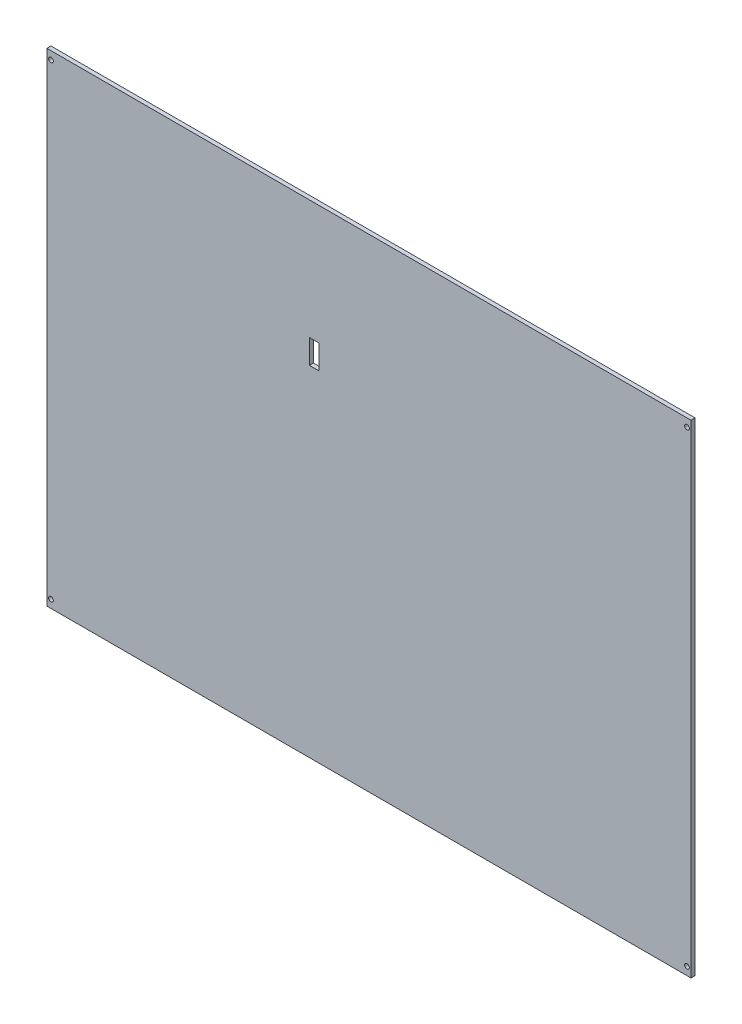
ISO-10303-21;
HEADER;
FILE_DESCRIPTION(('STEP AP214'),'2;1');
FILE_NAME('part.step','',(''),(''),'','','');
FILE_SCHEMA(('AUTOMOTIVE_DESIGN { 1 0 10303 214 1 1 1 1 }'));
ENDSEC;
DATA;
#1=APPLICATION_CONTEXT('core data for automotive mechanical design processes');
#2=APPLICATION_PROTOCOL_DEFINITION('international standard','automotive_design',2000,#1);
#3=PRODUCT_CONTEXT('',#1,'mechanical');
#4=PRODUCT('Part','Part','',(#3));
#5=PRODUCT_RELATED_PRODUCT_CATEGORY('part','',(#4));
#6=PRODUCT_DEFINITION_FORMATION('','',#4);
#7=PRODUCT_DEFINITION_CONTEXT('part definition',#1,'design');
#8=PRODUCT_DEFINITION('design','',#6,#7);
#9=PRODUCT_DEFINITION_SHAPE('','',#8);
#10=(LENGTH_UNIT() NAMED_UNIT(*) SI_UNIT(.MILLI.,.METRE.));
#11=(NAMED_UNIT(*) PLANE_ANGLE_UNIT() SI_UNIT($,.RADIAN.));
#12=(NAMED_UNIT(*) SI_UNIT($,.STERADIAN.) SOLID_ANGLE_UNIT());
#13=UNCERTAINTY_MEASURE_WITH_UNIT(LENGTH_MEASURE(1.E-05),#10,'distance_accuracy_value','');
#14=(GEOMETRIC_REPRESENTATION_CONTEXT(3) GLOBAL_UNCERTAINTY_ASSIGNED_CONTEXT((#13)) GLOBAL_UNIT_ASSIGNED_CONTEXT((#10,
#11,#12)) REPRESENTATION_CONTEXT('',''));
#15=CARTESIAN_POINT('',(0.,0.,0.));
#16=DIRECTION('',(0.,0.,1.));
#17=DIRECTION('',(1.,0.,0.));
#18=AXIS2_PLACEMENT_3D('',#15,#16,#17);
#19=CARTESIAN_POINT('',(254.,-190.5,3.175));
#20=DIRECTION('',(-1.,0.,0.));
#21=DIRECTION('',(0.,0.,1.));
#22=AXIS2_PLACEMENT_3D('',#19,#20,#21);
#23=PLANE('',#22);
#24=DIRECTION('',(0.,1.,0.));
#25=VECTOR('',#24,1.);
#26=CARTESIAN_POINT('',(254.,-190.5,0.));
#27=LINE('',#26,#25);
#28=CARTESIAN_POINT('',(254.,-190.5,0.));
#29=VERTEX_POINT('',#28);
#30=CARTESIAN_POINT('',(254.,190.5,0.));
#31=VERTEX_POINT('',#30);
#32=EDGE_CURVE('E182',#29,#31,#27,.T.);
#33=ORIENTED_EDGE('',*,*,#32,.T.);
#34=DIRECTION('',(0.,0.,-1.));
#35=VECTOR('',#34,1.);
#36=CARTESIAN_POINT('',(254.,190.5,3.175));
#37=LINE('',#36,#35);
#38=CARTESIAN_POINT('',(254.,190.5,3.175));
#39=VERTEX_POINT('',#38);
#40=EDGE_CURVE('E11',#39,#31,#37,.T.);
#41=ORIENTED_EDGE('',*,*,#40,.F.);
#42=DIRECTION('',(0.,1.,0.));
#43=VECTOR('',#42,1.);
#44=CARTESIAN_POINT('',(254.,-190.5,3.175));
#45=LINE('',#44,#43);
#46=CARTESIAN_POINT('',(254.,-190.5,3.175));
#47=VERTEX_POINT('',#46);
#48=EDGE_CURVE('E186',#47,#39,#45,.T.);
#49=ORIENTED_EDGE('',*,*,#48,.F.);
#50=DIRECTION('',(0.,0.,-1.));
#51=VECTOR('',#50,1.);
#52=CARTESIAN_POINT('',(254.,-190.5,3.175));
#53=LINE('',#52,#51);
#54=EDGE_CURVE('E200',#47,#29,#53,.T.);
#55=ORIENTED_EDGE('',*,*,#54,.T.);
#56=EDGE_LOOP('',(#33,#41,#49,#55));
#57=FACE_BOUND('',#56,.T.);
#58=ADVANCED_FACE('F42',(#57),#23,.F.);
#59=CARTESIAN_POINT('',(-254.,190.5,3.175));
#60=DIRECTION('',(0.,-1.,0.));
#61=DIRECTION('',(0.,0.,-1.));
#62=AXIS2_PLACEMENT_3D('',#59,#60,#61);
#63=PLANE('',#62);
#64=DIRECTION('',(-1.,0.,0.));
#65=VECTOR('',#64,1.);
#66=CARTESIAN_POINT('',(-254.,190.5,0.));
#67=LINE('',#66,#65);
#68=CARTESIAN_POINT('',(-254.,190.5,0.));
#69=VERTEX_POINT('',#68);
#70=EDGE_CURVE('E204',#31,#69,#67,.T.);
#71=ORIENTED_EDGE('',*,*,#70,.T.);
#72=DIRECTION('',(0.,0.,-1.));
#73=VECTOR('',#72,1.);
#74=CARTESIAN_POINT('',(-254.,190.5,3.175));
#75=LINE('',#74,#73);
#76=CARTESIAN_POINT('',(-254.,190.5,3.175));
#77=VERTEX_POINT('',#76);
#78=EDGE_CURVE('E50',#77,#69,#75,.T.);
#79=ORIENTED_EDGE('',*,*,#78,.F.);
#80=DIRECTION('',(-1.,0.,0.));
#81=VECTOR('',#80,1.);
#82=CARTESIAN_POINT('',(-254.,190.5,3.175));
#83=LINE('',#82,#81);
#84=EDGE_CURVE('E190',#39,#77,#83,.T.);
#85=ORIENTED_EDGE('',*,*,#84,.F.);
#86=ORIENTED_EDGE('',*,*,#40,.T.);
#87=EDGE_LOOP('',(#71,#79,#85,#86));
#88=FACE_BOUND('',#87,.T.);
#89=ADVANCED_FACE('F239',(#88),#63,.F.);
#90=CARTESIAN_POINT('',(-254.,-190.5,3.175));
#91=DIRECTION('',(1.,0.,0.));
#92=DIRECTION('',(0.,0.,-1.));
#93=AXIS2_PLACEMENT_3D('',#90,#91,#92);
#94=PLANE('',#93);
#95=DIRECTION('',(0.,-1.,0.));
#96=VECTOR('',#95,1.);
#97=CARTESIAN_POINT('',(-254.,-190.5,0.));
#98=LINE('',#97,#96);
#99=CARTESIAN_POINT('',(-254.,-190.5,0.));
#100=VERTEX_POINT('',#99);
#101=EDGE_CURVE('E207',#69,#100,#98,.T.);
#102=ORIENTED_EDGE('',*,*,#101,.T.);
#103=DIRECTION('',(0.,0.,-1.));
#104=VECTOR('',#103,1.);
#105=CARTESIAN_POINT('',(-254.,-190.5,3.175));
#106=LINE('',#105,#104);
#107=CARTESIAN_POINT('',(-254.,-190.5,3.175));
#108=VERTEX_POINT('',#107);
#109=EDGE_CURVE('E215',#108,#100,#106,.T.);
#110=ORIENTED_EDGE('',*,*,#109,.F.);
#111=DIRECTION('',(0.,-1.,0.));
#112=VECTOR('',#111,1.);
#113=CARTESIAN_POINT('',(-254.,-190.5,3.175));
#114=LINE('',#113,#112);
#115=EDGE_CURVE('E194',#77,#108,#114,.T.);
#116=ORIENTED_EDGE('',*,*,#115,.F.);
#117=ORIENTED_EDGE('',*,*,#78,.T.);
#118=EDGE_LOOP('',(#102,#110,#116,#117));
#119=FACE_BOUND('',#118,.T.);
#120=ADVANCED_FACE('F224',(#119),#94,.F.);
#121=CARTESIAN_POINT('',(-254.,-190.5,3.175));
#122=DIRECTION('',(0.,1.,0.));
#123=DIRECTION('',(0.,0.,1.));
#124=AXIS2_PLACEMENT_3D('',#121,#122,#123);
#125=PLANE('',#124);
#126=DIRECTION('',(1.,0.,0.));
#127=VECTOR('',#126,1.);
#128=CARTESIAN_POINT('',(-254.,-190.5,0.));
#129=LINE('',#128,#127);
#130=EDGE_CURVE('E191',#100,#29,#129,.T.);
#131=ORIENTED_EDGE('',*,*,#130,.T.);
#132=ORIENTED_EDGE('',*,*,#54,.F.);
#133=DIRECTION('',(1.,0.,0.));
#134=VECTOR('',#133,1.);
#135=CARTESIAN_POINT('',(-254.,-190.5,3.175));
#136=LINE('',#135,#134);
#137=EDGE_CURVE('E197',#108,#47,#136,.T.);
#138=ORIENTED_EDGE('',*,*,#137,.F.);
#139=ORIENTED_EDGE('',*,*,#109,.T.);
#140=EDGE_LOOP('',(#131,#132,#138,#139));
#141=FACE_BOUND('',#140,.T.);
#142=ADVANCED_FACE('F232',(#141),#125,.F.);
#143=CARTESIAN_POINT('',(0.,0.,3.175));
#144=DIRECTION('',(0.,0.,-1.));
#145=DIRECTION('',(-1.,0.,0.));
#146=AXIS2_PLACEMENT_3D('',#143,#144,#145);
#147=PLANE('',#146);
#148=DIRECTION('',(0.,1.,0.));
#149=VECTOR('',#148,1.);
#150=CARTESIAN_POINT('',(-39.3700000000001,77.47,3.175));
#151=LINE('',#150,#149);
#152=CARTESIAN_POINT('',(-39.3700000000001,77.47,3.175));
#153=VERTEX_POINT('',#152);
#154=CARTESIAN_POINT('',(-39.3700000000001,96.52,3.175));
#155=VERTEX_POINT('',#154);
#156=EDGE_CURVE('E135',#153,#155,#151,.T.);
#157=ORIENTED_EDGE('',*,*,#156,.F.);
#158=DIRECTION('',(1.,0.,0.));
#159=VECTOR('',#158,1.);
#160=CARTESIAN_POINT('',(-46.9900000000001,77.47,3.175));
#161=LINE('',#160,#159);
#162=CARTESIAN_POINT('',(-46.9900000000001,77.47,3.175));
#163=VERTEX_POINT('',#162);
#164=EDGE_CURVE('E125',#163,#153,#161,.T.);
#165=ORIENTED_EDGE('',*,*,#164,.F.);
#166=DIRECTION('',(0.,-1.,0.));
#167=VECTOR('',#166,1.);
#168=CARTESIAN_POINT('',(-46.9900000000001,77.47,3.175));
#169=LINE('',#168,#167);
#170=CARTESIAN_POINT('',(-46.9900000000001,96.52,3.175));
#171=VERTEX_POINT('',#170);
#172=EDGE_CURVE('E139',#171,#163,#169,.T.);
#173=ORIENTED_EDGE('',*,*,#172,.F.);
#174=DIRECTION('',(-1.,0.,0.));
#175=VECTOR('',#174,1.);
#176=CARTESIAN_POINT('',(-46.9900000000001,96.52,3.175));
#177=LINE('',#176,#175);
#178=EDGE_CURVE('E57',#155,#171,#177,.T.);
#179=ORIENTED_EDGE('',*,*,#178,.F.);
#180=EDGE_LOOP('',(#157,#165,#173,#179));
#181=FACE_BOUND('',#180,.T.);
#182=CARTESIAN_POINT('',(250.825,-184.15,3.175));
#183=DIRECTION('',(0.,0.,1.));
#184=DIRECTION('',(1.,0.,0.));
#185=AXIS2_PLACEMENT_3D('',#182,#183,#184);
#186=CIRCLE('',#185,1.85419999999999);
#187=CARTESIAN_POINT('',(252.6792,-184.15,3.175));
#188=VERTEX_POINT('',#187);
#189=EDGE_CURVE('E171',#188,#188,#186,.T.);
#190=ORIENTED_EDGE('',*,*,#189,.F.);
#191=EDGE_LOOP('',(#190));
#192=FACE_BOUND('',#191,.T.);
#193=CARTESIAN_POINT('',(250.825,184.15,3.175));
#194=DIRECTION('',(0.,0.,1.));
#195=DIRECTION('',(1.,0.,0.));
#196=AXIS2_PLACEMENT_3D('',#193,#194,#195);
#197=CIRCLE('',#196,1.85419999999999);
#198=CARTESIAN_POINT('',(252.6792,184.15,3.175));
#199=VERTEX_POINT('',#198);
#200=EDGE_CURVE('E163',#199,#199,#197,.T.);
#201=ORIENTED_EDGE('',*,*,#200,.F.);
#202=EDGE_LOOP('',(#201));
#203=FACE_BOUND('',#202,.T.);
#204=CARTESIAN_POINT('',(-250.825,184.15,3.175));
#205=DIRECTION('',(0.,0.,1.));
#206=DIRECTION('',(1.,0.,0.));
#207=AXIS2_PLACEMENT_3D('',#204,#205,#206);
#208=CIRCLE('',#207,1.85419999999999);
#209=CARTESIAN_POINT('',(-248.9708,184.15,3.175));
#210=VERTEX_POINT('',#209);
#211=EDGE_CURVE('E154',#210,#210,#208,.T.);
#212=ORIENTED_EDGE('',*,*,#211,.F.);
#213=EDGE_LOOP('',(#212));
#214=FACE_BOUND('',#213,.T.);
#215=CARTESIAN_POINT('',(-250.825,-184.15,3.175));
#216=DIRECTION('',(0.,0.,1.));
#217=DIRECTION('',(1.,0.,0.));
#218=AXIS2_PLACEMENT_3D('',#215,#216,#217);
#219=CIRCLE('',#218,1.85419999999999);
#220=CARTESIAN_POINT('',(-248.9708,-184.15,3.175));
#221=VERTEX_POINT('',#220);
#222=EDGE_CURVE('E158',#221,#221,#219,.T.);
#223=ORIENTED_EDGE('',*,*,#222,.F.);
#224=EDGE_LOOP('',(#223));
#225=FACE_BOUND('',#224,.T.);
#226=ORIENTED_EDGE('',*,*,#48,.T.);
#227=ORIENTED_EDGE('',*,*,#84,.T.);
#228=ORIENTED_EDGE('',*,*,#115,.T.);
#229=ORIENTED_EDGE('',*,*,#137,.T.);
#230=EDGE_LOOP('',(#226,#227,#228,#229));
#231=FACE_BOUND('',#230,.T.);
#232=ADVANCED_FACE('F238',(#181,#192,#203,#214,#225,#231),#147,.F.);
#233=CARTESIAN_POINT('',(0.,0.,0.));
#234=DIRECTION('',(0.,0.,-1.));
#235=DIRECTION('',(-1.,0.,0.));
#236=AXIS2_PLACEMENT_3D('',#233,#234,#235);
#237=PLANE('',#236);
#238=DIRECTION('',(1.,0.,0.));
#239=VECTOR('',#238,1.);
#240=CARTESIAN_POINT('',(-46.9900000000001,77.47,0.));
#241=LINE('',#240,#239);
#242=CARTESIAN_POINT('',(-46.9900000000001,77.47,0.));
#243=VERTEX_POINT('',#242);
#244=CARTESIAN_POINT('',(-39.3700000000001,77.47,0.));
#245=VERTEX_POINT('',#244);
#246=EDGE_CURVE('E122',#243,#245,#241,.T.);
#247=ORIENTED_EDGE('',*,*,#246,.T.);
#248=DIRECTION('',(0.,1.,0.));
#249=VECTOR('',#248,1.);
#250=CARTESIAN_POINT('',(-39.3700000000001,77.47,0.));
#251=LINE('',#250,#249);
#252=CARTESIAN_POINT('',(-39.3700000000001,96.52,0.));
#253=VERTEX_POINT('',#252);
#254=EDGE_CURVE('E108',#245,#253,#251,.T.);
#255=ORIENTED_EDGE('',*,*,#254,.T.);
#256=DIRECTION('',(-1.,0.,0.));
#257=VECTOR('',#256,1.);
#258=CARTESIAN_POINT('',(-46.9900000000001,96.52,0.));
#259=LINE('',#258,#257);
#260=CARTESIAN_POINT('',(-46.9900000000001,96.52,0.));
#261=VERTEX_POINT('',#260);
#262=EDGE_CURVE('E144',#253,#261,#259,.T.);
#263=ORIENTED_EDGE('',*,*,#262,.T.);
#264=DIRECTION('',(0.,-1.,0.));
#265=VECTOR('',#264,1.);
#266=CARTESIAN_POINT('',(-46.9900000000001,77.47,0.));
#267=LINE('',#266,#265);
#268=EDGE_CURVE('E131',#261,#243,#267,.T.);
#269=ORIENTED_EDGE('',*,*,#268,.T.);
#270=EDGE_LOOP('',(#247,#255,#263,#269));
#271=FACE_BOUND('',#270,.T.);
#272=CARTESIAN_POINT('',(250.825,-184.15,0.));
#273=DIRECTION('',(0.,0.,1.));
#274=DIRECTION('',(1.,0.,0.));
#275=AXIS2_PLACEMENT_3D('',#272,#273,#274);
#276=CIRCLE('',#275,1.85419999999999);
#277=CARTESIAN_POINT('',(252.6792,-184.15,0.));
#278=VERTEX_POINT('',#277);
#279=EDGE_CURVE('E153',#278,#278,#276,.T.);
#280=ORIENTED_EDGE('',*,*,#279,.T.);
#281=EDGE_LOOP('',(#280));
#282=FACE_BOUND('',#281,.T.);
#283=CARTESIAN_POINT('',(250.825,184.15,0.));
#284=DIRECTION('',(0.,0.,1.));
#285=DIRECTION('',(1.,0.,0.));
#286=AXIS2_PLACEMENT_3D('',#283,#284,#285);
#287=CIRCLE('',#286,1.85419999999999);
#288=CARTESIAN_POINT('',(252.6792,184.15,0.));
#289=VERTEX_POINT('',#288);
#290=EDGE_CURVE('E167',#289,#289,#287,.T.);
#291=ORIENTED_EDGE('',*,*,#290,.T.);
#292=EDGE_LOOP('',(#291));
#293=FACE_BOUND('',#292,.T.);
#294=CARTESIAN_POINT('',(-250.825,184.15,0.));
#295=DIRECTION('',(0.,0.,1.));
#296=DIRECTION('',(1.,0.,0.));
#297=AXIS2_PLACEMENT_3D('',#294,#295,#296);
#298=CIRCLE('',#297,1.85419999999999);
#299=CARTESIAN_POINT('',(-248.9708,184.15,0.));
#300=VERTEX_POINT('',#299);
#301=EDGE_CURVE('E159',#300,#300,#298,.T.);
#302=ORIENTED_EDGE('',*,*,#301,.T.);
#303=EDGE_LOOP('',(#302));
#304=FACE_BOUND('',#303,.T.);
#305=CARTESIAN_POINT('',(-250.825,-184.15,0.));
#306=DIRECTION('',(0.,0.,1.));
#307=DIRECTION('',(1.,0.,0.));
#308=AXIS2_PLACEMENT_3D('',#305,#306,#307);
#309=CIRCLE('',#308,1.85419999999999);
#310=CARTESIAN_POINT('',(-248.9708,-184.15,0.));
#311=VERTEX_POINT('',#310);
#312=EDGE_CURVE('E178',#311,#311,#309,.T.);
#313=ORIENTED_EDGE('',*,*,#312,.T.);
#314=EDGE_LOOP('',(#313));
#315=FACE_BOUND('',#314,.T.);
#316=ORIENTED_EDGE('',*,*,#32,.F.);
#317=ORIENTED_EDGE('',*,*,#130,.F.);
#318=ORIENTED_EDGE('',*,*,#101,.F.);
#319=ORIENTED_EDGE('',*,*,#70,.F.);
#320=EDGE_LOOP('',(#316,#317,#318,#319));
#321=FACE_BOUND('',#320,.T.);
#322=ADVANCED_FACE('F129',(#271,#282,#293,#304,#315,#321),#237,.T.);
#323=CARTESIAN_POINT('',(-250.825,-184.15,0.));
#324=DIRECTION('',(0.,0.,1.));
#325=DIRECTION('',(1.,0.,0.));
#326=AXIS2_PLACEMENT_3D('',#323,#324,#325);
#327=CYLINDRICAL_SURFACE('',#326,1.85419999999999);
#328=ORIENTED_EDGE('',*,*,#312,.F.);
#329=EDGE_LOOP('',(#328));
#330=FACE_BOUND('',#329,.T.);
#331=ORIENTED_EDGE('',*,*,#222,.T.);
#332=EDGE_LOOP('',(#331));
#333=FACE_BOUND('',#332,.T.);
#334=ADVANCED_FACE('F251',(#330,#333),#327,.F.);
#335=CARTESIAN_POINT('',(-250.825,184.15,0.));
#336=DIRECTION('',(0.,0.,1.));
#337=DIRECTION('',(1.,0.,0.));
#338=AXIS2_PLACEMENT_3D('',#335,#336,#337);
#339=CYLINDRICAL_SURFACE('',#338,1.85419999999999);
#340=ORIENTED_EDGE('',*,*,#301,.F.);
#341=EDGE_LOOP('',(#340));
#342=FACE_BOUND('',#341,.T.);
#343=ORIENTED_EDGE('',*,*,#211,.T.);
#344=EDGE_LOOP('',(#343));
#345=FACE_BOUND('',#344,.T.);
#346=ADVANCED_FACE('F257',(#342,#345),#339,.F.);
#347=CARTESIAN_POINT('',(250.825,184.15,0.));
#348=DIRECTION('',(0.,0.,1.));
#349=DIRECTION('',(1.,0.,0.));
#350=AXIS2_PLACEMENT_3D('',#347,#348,#349);
#351=CYLINDRICAL_SURFACE('',#350,1.85419999999999);
#352=ORIENTED_EDGE('',*,*,#290,.F.);
#353=EDGE_LOOP('',(#352));
#354=FACE_BOUND('',#353,.T.);
#355=ORIENTED_EDGE('',*,*,#200,.T.);
#356=EDGE_LOOP('',(#355));
#357=FACE_BOUND('',#356,.T.);
#358=ADVANCED_FACE('F262',(#354,#357),#351,.F.);
#359=CARTESIAN_POINT('',(250.825,-184.15,0.));
#360=DIRECTION('',(0.,0.,1.));
#361=DIRECTION('',(1.,0.,0.));
#362=AXIS2_PLACEMENT_3D('',#359,#360,#361);
#363=CYLINDRICAL_SURFACE('',#362,1.85419999999999);
#364=ORIENTED_EDGE('',*,*,#279,.F.);
#365=EDGE_LOOP('',(#364));
#366=FACE_BOUND('',#365,.T.);
#367=ORIENTED_EDGE('',*,*,#189,.T.);
#368=EDGE_LOOP('',(#367));
#369=FACE_BOUND('',#368,.T.);
#370=ADVANCED_FACE('F259',(#366,#369),#363,.F.);
#371=CARTESIAN_POINT('',(-46.9900000000001,77.47,-20.5174779151825));
#372=DIRECTION('',(0.,-1.,0.));
#373=DIRECTION('',(0.,0.,-1.));
#374=AXIS2_PLACEMENT_3D('',#371,#372,#373);
#375=PLANE('',#374);
#376=DIRECTION('',(0.,0.,1.));
#377=VECTOR('',#376,1.);
#378=CARTESIAN_POINT('',(-46.9900000000001,77.47,-20.5174779151825));
#379=LINE('',#378,#377);
#380=EDGE_CURVE('E65',#243,#163,#379,.T.);
#381=ORIENTED_EDGE('',*,*,#380,.T.);
#382=ORIENTED_EDGE('',*,*,#164,.T.);
#383=DIRECTION('',(0.,0.,1.));
#384=VECTOR('',#383,1.);
#385=CARTESIAN_POINT('',(-39.3700000000001,77.47,-20.5174779151825));
#386=LINE('',#385,#384);
#387=EDGE_CURVE('E112',#245,#153,#386,.T.);
#388=ORIENTED_EDGE('',*,*,#387,.F.);
#389=ORIENTED_EDGE('',*,*,#246,.F.);
#390=EDGE_LOOP('',(#381,#382,#388,#389));
#391=FACE_BOUND('',#390,.T.);
#392=ADVANCED_FACE('F121',(#391),#375,.F.);
#393=CARTESIAN_POINT('',(-39.3700000000001,77.47,-20.5174779151825));
#394=DIRECTION('',(1.,0.,0.));
#395=DIRECTION('',(0.,0.,-1.));
#396=AXIS2_PLACEMENT_3D('',#393,#394,#395);
#397=PLANE('',#396);
#398=ORIENTED_EDGE('',*,*,#387,.T.);
#399=ORIENTED_EDGE('',*,*,#156,.T.);
#400=DIRECTION('',(0.,0.,1.));
#401=VECTOR('',#400,1.);
#402=CARTESIAN_POINT('',(-39.3700000000001,96.52,-20.5174779151825));
#403=LINE('',#402,#401);
#404=EDGE_CURVE('E114',#253,#155,#403,.T.);
#405=ORIENTED_EDGE('',*,*,#404,.F.);
#406=ORIENTED_EDGE('',*,*,#254,.F.);
#407=EDGE_LOOP('',(#398,#399,#405,#406));
#408=FACE_BOUND('',#407,.T.);
#409=ADVANCED_FACE('F110',(#408),#397,.F.);
#410=CARTESIAN_POINT('',(-46.9900000000001,96.52,-20.5174779151825));
#411=DIRECTION('',(0.,1.,0.));
#412=DIRECTION('',(0.,0.,1.));
#413=AXIS2_PLACEMENT_3D('',#410,#411,#412);
#414=PLANE('',#413);
#415=ORIENTED_EDGE('',*,*,#404,.T.);
#416=ORIENTED_EDGE('',*,*,#178,.T.);
#417=DIRECTION('',(0.,0.,1.));
#418=VECTOR('',#417,1.);
#419=CARTESIAN_POINT('',(-46.9900000000001,96.52,-20.5174779151825));
#420=LINE('',#419,#418);
#421=EDGE_CURVE('E143',#261,#171,#420,.T.);
#422=ORIENTED_EDGE('',*,*,#421,.F.);
#423=ORIENTED_EDGE('',*,*,#262,.F.);
#424=EDGE_LOOP('',(#415,#416,#422,#423));
#425=FACE_BOUND('',#424,.T.);
#426=ADVANCED_FACE('F274',(#425),#414,.F.);
#427=CARTESIAN_POINT('',(-46.9900000000001,77.47,-20.5174779151825));
#428=DIRECTION('',(-1.,0.,0.));
#429=DIRECTION('',(0.,0.,1.));
#430=AXIS2_PLACEMENT_3D('',#427,#428,#429);
#431=PLANE('',#430);
#432=ORIENTED_EDGE('',*,*,#421,.T.);
#433=ORIENTED_EDGE('',*,*,#172,.T.);
#434=ORIENTED_EDGE('',*,*,#380,.F.);
#435=ORIENTED_EDGE('',*,*,#268,.F.);
#436=EDGE_LOOP('',(#432,#433,#434,#435));
#437=FACE_BOUND('',#436,.T.);
#438=ADVANCED_FACE('F277',(#437),#431,.F.);
#439=CLOSED_SHELL('',(#58,#89,#120,#142,#232,#322,#334,#346,#358,#370,#392,#409,#426,#438));
#440=MANIFOLD_SOLID_BREP('B2',#439);
#441=ADVANCED_BREP_SHAPE_REPRESENTATION('',(#18,#440),#14);
#442=SHAPE_DEFINITION_REPRESENTATION(#9,#441);
ENDSEC;
END-ISO-10303-21;
